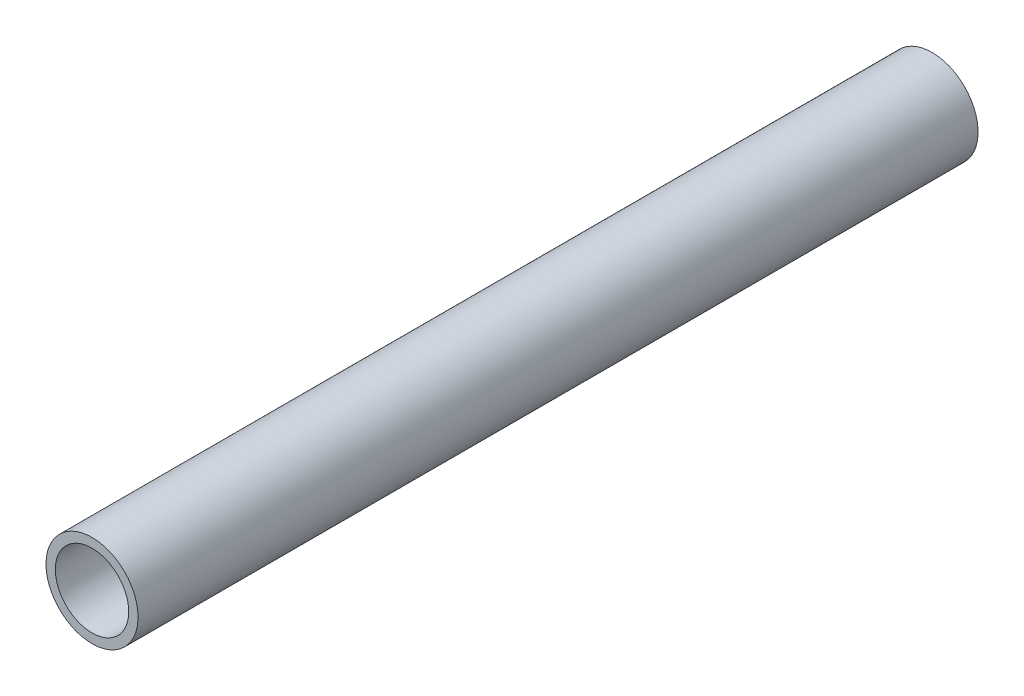
ISO-10303-21;
HEADER;
FILE_DESCRIPTION(('STEP AP214'),'2;1');
FILE_NAME('part.step','',(''),(''),'','','');
FILE_SCHEMA(('AUTOMOTIVE_DESIGN { 1 0 10303 214 1 1 1 1 }'));
ENDSEC;
DATA;
#1=APPLICATION_CONTEXT('core data for automotive mechanical design processes');
#2=APPLICATION_PROTOCOL_DEFINITION('international standard','automotive_design',2000,#1);
#3=PRODUCT_CONTEXT('',#1,'mechanical');
#4=PRODUCT('Part','Part','',(#3));
#5=PRODUCT_RELATED_PRODUCT_CATEGORY('part','',(#4));
#6=PRODUCT_DEFINITION_FORMATION('','',#4);
#7=PRODUCT_DEFINITION_CONTEXT('part definition',#1,'design');
#8=PRODUCT_DEFINITION('design','',#6,#7);
#9=PRODUCT_DEFINITION_SHAPE('','',#8);
#10=(LENGTH_UNIT() NAMED_UNIT(*) SI_UNIT(.MILLI.,.METRE.));
#11=(NAMED_UNIT(*) PLANE_ANGLE_UNIT() SI_UNIT($,.RADIAN.));
#12=(NAMED_UNIT(*) SI_UNIT($,.STERADIAN.) SOLID_ANGLE_UNIT());
#13=UNCERTAINTY_MEASURE_WITH_UNIT(LENGTH_MEASURE(1.E-05),#10,'distance_accuracy_value','');
#14=(GEOMETRIC_REPRESENTATION_CONTEXT(3) GLOBAL_UNCERTAINTY_ASSIGNED_CONTEXT((#13)) GLOBAL_UNIT_ASSIGNED_CONTEXT((#10,
#11,#12)) REPRESENTATION_CONTEXT('',''));
#15=CARTESIAN_POINT('',(0.,0.,0.));
#16=DIRECTION('',(0.,0.,1.));
#17=DIRECTION('',(1.,0.,0.));
#18=AXIS2_PLACEMENT_3D('',#15,#16,#17);
#19=CARTESIAN_POINT('',(0.,0.,152.4));
#20=DIRECTION('',(0.,0.,1.));
#21=DIRECTION('',(1.,0.,0.));
#22=AXIS2_PLACEMENT_3D('',#19,#20,#21);
#23=PLANE('',#22);
#24=CARTESIAN_POINT('',(0.,0.,152.4));
#25=DIRECTION('',(0.,0.,1.));
#26=DIRECTION('',(1.,0.,0.));
#27=AXIS2_PLACEMENT_3D('',#24,#25,#26);
#28=CIRCLE('',#27,16.7005);
#29=CARTESIAN_POINT('',(-16.7005,0.,152.4));
#30=VERTEX_POINT('',#29);
#31=EDGE_CURVE('E11',#30,#30,#28,.T.);
#32=ORIENTED_EDGE('',*,*,#31,.T.);
#33=EDGE_LOOP('',(#32));
#34=FACE_BOUND('',#33,.T.);
#35=CARTESIAN_POINT('',(0.,0.,152.4));
#36=DIRECTION('',(0.,0.,1.));
#37=DIRECTION('',(1.,0.,0.));
#38=AXIS2_PLACEMENT_3D('',#35,#36,#37);
#39=CIRCLE('',#38,13.3223);
#40=CARTESIAN_POINT('',(-13.3223,0.,152.4));
#41=VERTEX_POINT('',#40);
#42=EDGE_CURVE('E52',#41,#41,#39,.T.);
#43=ORIENTED_EDGE('',*,*,#42,.F.);
#44=EDGE_LOOP('',(#43));
#45=FACE_BOUND('',#44,.T.);
#46=ADVANCED_FACE('F41',(#34,#45),#23,.T.);
#47=CARTESIAN_POINT('',(0.,0.,-152.4));
#48=DIRECTION('',(0.,0.,1.));
#49=DIRECTION('',(1.,0.,0.));
#50=AXIS2_PLACEMENT_3D('',#47,#48,#49);
#51=PLANE('',#50);
#52=CARTESIAN_POINT('',(0.,0.,-152.4));
#53=DIRECTION('',(0.,0.,1.));
#54=DIRECTION('',(1.,0.,0.));
#55=AXIS2_PLACEMENT_3D('',#52,#53,#54);
#56=CIRCLE('',#55,16.7005);
#57=CARTESIAN_POINT('',(-16.7005,0.,-152.4));
#58=VERTEX_POINT('',#57);
#59=EDGE_CURVE('E45',#58,#58,#56,.T.);
#60=ORIENTED_EDGE('',*,*,#59,.F.);
#61=EDGE_LOOP('',(#60));
#62=FACE_BOUND('',#61,.T.);
#63=CARTESIAN_POINT('',(0.,0.,-152.4));
#64=DIRECTION('',(0.,0.,1.));
#65=DIRECTION('',(1.,0.,0.));
#66=AXIS2_PLACEMENT_3D('',#63,#64,#65);
#67=CIRCLE('',#66,13.3223);
#68=CARTESIAN_POINT('',(-13.3223,0.,-152.4));
#69=VERTEX_POINT('',#68);
#70=EDGE_CURVE('E54',#69,#69,#67,.T.);
#71=ORIENTED_EDGE('',*,*,#70,.T.);
#72=EDGE_LOOP('',(#71));
#73=FACE_BOUND('',#72,.T.);
#74=ADVANCED_FACE('F64',(#62,#73),#51,.F.);
#75=CARTESIAN_POINT('',(0.,0.,152.4));
#76=DIRECTION('',(0.,0.,-1.));
#77=DIRECTION('',(-1.,0.,0.));
#78=AXIS2_PLACEMENT_3D('',#75,#76,#77);
#79=CYLINDRICAL_SURFACE('',#78,16.7005);
#80=CARTESIAN_POINT('',(-16.7005,0.,152.4));
#81=CARTESIAN_POINT('',(-16.7005,0.,149.225));
#82=CARTESIAN_POINT('',(-16.7005,0.,146.05));
#83=CARTESIAN_POINT('',(-16.7005,0.,139.7));
#84=CARTESIAN_POINT('',(-16.7005,0.,136.525));
#85=CARTESIAN_POINT('',(-16.7005,0.,130.175));
#86=CARTESIAN_POINT('',(-16.7005,0.,127.));
#87=CARTESIAN_POINT('',(-16.7005,0.,120.65));
#88=CARTESIAN_POINT('',(-16.7005,0.,117.475));
#89=CARTESIAN_POINT('',(-16.7005,0.,111.125));
#90=CARTESIAN_POINT('',(-16.7005,0.,107.95));
#91=CARTESIAN_POINT('',(-16.7005,0.,101.6));
#92=CARTESIAN_POINT('',(-16.7005,0.,98.425));
#93=CARTESIAN_POINT('',(-16.7005,0.,92.075));
#94=CARTESIAN_POINT('',(-16.7005,0.,88.9));
#95=CARTESIAN_POINT('',(-16.7005,0.,82.55));
#96=CARTESIAN_POINT('',(-16.7005,0.,79.375));
#97=CARTESIAN_POINT('',(-16.7005,0.,73.025));
#98=CARTESIAN_POINT('',(-16.7005,0.,69.85));
#99=CARTESIAN_POINT('',(-16.7005,0.,63.5));
#100=CARTESIAN_POINT('',(-16.7005,0.,60.325));
#101=CARTESIAN_POINT('',(-16.7005,0.,53.975));
#102=CARTESIAN_POINT('',(-16.7005,0.,50.8));
#103=CARTESIAN_POINT('',(-16.7005,0.,44.45));
#104=CARTESIAN_POINT('',(-16.7005,0.,41.275));
#105=CARTESIAN_POINT('',(-16.7005,0.,34.925));
#106=CARTESIAN_POINT('',(-16.7005,0.,31.75));
#107=CARTESIAN_POINT('',(-16.7005,0.,25.4));
#108=CARTESIAN_POINT('',(-16.7005,0.,22.225));
#109=CARTESIAN_POINT('',(-16.7005,0.,15.875));
#110=CARTESIAN_POINT('',(-16.7005,0.,12.7));
#111=CARTESIAN_POINT('',(-16.7005,0.,6.35));
#112=CARTESIAN_POINT('',(-16.7005,0.,3.175));
#113=CARTESIAN_POINT('',(-16.7005,0.,-3.175));
#114=CARTESIAN_POINT('',(-16.7005,0.,-6.35));
#115=CARTESIAN_POINT('',(-16.7005,0.,-12.7));
#116=CARTESIAN_POINT('',(-16.7005,0.,-15.875));
#117=CARTESIAN_POINT('',(-16.7005,0.,-22.225));
#118=CARTESIAN_POINT('',(-16.7005,0.,-25.4));
#119=CARTESIAN_POINT('',(-16.7005,0.,-31.75));
#120=CARTESIAN_POINT('',(-16.7005,0.,-34.925));
#121=CARTESIAN_POINT('',(-16.7005,0.,-41.275));
#122=CARTESIAN_POINT('',(-16.7005,0.,-44.45));
#123=CARTESIAN_POINT('',(-16.7005,0.,-50.8));
#124=CARTESIAN_POINT('',(-16.7005,0.,-53.975));
#125=CARTESIAN_POINT('',(-16.7005,0.,-60.325));
#126=CARTESIAN_POINT('',(-16.7005,0.,-63.5));
#127=CARTESIAN_POINT('',(-16.7005,0.,-69.85));
#128=CARTESIAN_POINT('',(-16.7005,0.,-73.025));
#129=CARTESIAN_POINT('',(-16.7005,0.,-79.375));
#130=CARTESIAN_POINT('',(-16.7005,0.,-82.55));
#131=CARTESIAN_POINT('',(-16.7005,0.,-88.9));
#132=CARTESIAN_POINT('',(-16.7005,0.,-92.075));
#133=CARTESIAN_POINT('',(-16.7005,0.,-98.425));
#134=CARTESIAN_POINT('',(-16.7005,0.,-101.6));
#135=CARTESIAN_POINT('',(-16.7005,0.,-107.95));
#136=CARTESIAN_POINT('',(-16.7005,0.,-111.125));
#137=CARTESIAN_POINT('',(-16.7005,0.,-117.475));
#138=CARTESIAN_POINT('',(-16.7005,0.,-120.65));
#139=CARTESIAN_POINT('',(-16.7005,0.,-127.));
#140=CARTESIAN_POINT('',(-16.7005,0.,-130.175));
#141=CARTESIAN_POINT('',(-16.7005,0.,-136.525));
#142=CARTESIAN_POINT('',(-16.7005,0.,-139.7));
#143=CARTESIAN_POINT('',(-16.7005,0.,-146.05));
#144=CARTESIAN_POINT('',(-16.7005,0.,-149.225));
#145=CARTESIAN_POINT('',(-16.7005,0.,-152.4));
#146=B_SPLINE_CURVE_WITH_KNOTS('',3,(#80,#81,#82,#83,#84,#85,#86,#87,#88,#89,#90,#91,#92,#93,
#94,#95,#96,#97,#98,#99,#100,#101,#102,#103,#104,#105,#106,#107,#108,#109,#110,#111,#112,#113,
#114,#115,#116,#117,#118,#119,#120,#121,#122,#123,#124,#125,#126,#127,#128,#129,#130,#131,#132,
#133,#134,#135,#136,#137,#138,#139,#140,#141,#142,#143,#144,#145),.UNSPECIFIED.,.F.,.F.,(4,2,2,
2,2,2,2,2,2,2,2,2,2,2,2,2,2,2,2,2,2,2,2,2,2,2,2,2,2,2,2,2,4),(0.,9.52500000000001,19.05,28.575,
38.1,47.625,57.15,66.675,76.2,85.725,95.25,104.775,114.3,123.825,133.35,142.875,152.4,161.925,
171.45,180.975,190.5,200.025,209.55,219.075,228.6,238.125,247.65,257.175,266.7,276.225,285.75,
295.275,304.8),.UNSPECIFIED.);
#147=EDGE_CURVE('BSEAM43',#30,#58,#146,.T.);
#148=ORIENTED_EDGE('',*,*,#31,.F.);
#149=ORIENTED_EDGE('',*,*,#59,.T.);
#150=ORIENTED_EDGE('',*,*,#147,.T.);
#151=ORIENTED_EDGE('',*,*,#147,.F.);
#152=EDGE_LOOP('',(#148,#150,#149,#151));
#153=FACE_BOUND('',#152,.T.);
#154=ADVANCED_FACE('F43',(#153),#79,.T.);
#155=CARTESIAN_POINT('',(0.,0.,152.4));
#156=DIRECTION('',(0.,0.,-1.));
#157=DIRECTION('',(-1.,0.,0.));
#158=AXIS2_PLACEMENT_3D('',#155,#156,#157);
#159=CYLINDRICAL_SURFACE('',#158,13.3223);
#160=CARTESIAN_POINT('',(-13.3223,0.,152.4));
#161=CARTESIAN_POINT('',(-13.3223,0.,149.225));
#162=CARTESIAN_POINT('',(-13.3223,0.,146.05));
#163=CARTESIAN_POINT('',(-13.3223,0.,139.7));
#164=CARTESIAN_POINT('',(-13.3223,0.,136.525));
#165=CARTESIAN_POINT('',(-13.3223,0.,130.175));
#166=CARTESIAN_POINT('',(-13.3223,0.,127.));
#167=CARTESIAN_POINT('',(-13.3223,0.,120.65));
#168=CARTESIAN_POINT('',(-13.3223,0.,117.475));
#169=CARTESIAN_POINT('',(-13.3223,0.,111.125));
#170=CARTESIAN_POINT('',(-13.3223,0.,107.95));
#171=CARTESIAN_POINT('',(-13.3223,0.,101.6));
#172=CARTESIAN_POINT('',(-13.3223,0.,98.425));
#173=CARTESIAN_POINT('',(-13.3223,0.,92.075));
#174=CARTESIAN_POINT('',(-13.3223,0.,88.9));
#175=CARTESIAN_POINT('',(-13.3223,0.,82.55));
#176=CARTESIAN_POINT('',(-13.3223,0.,79.375));
#177=CARTESIAN_POINT('',(-13.3223,0.,73.025));
#178=CARTESIAN_POINT('',(-13.3223,0.,69.85));
#179=CARTESIAN_POINT('',(-13.3223,0.,63.5));
#180=CARTESIAN_POINT('',(-13.3223,0.,60.325));
#181=CARTESIAN_POINT('',(-13.3223,0.,53.975));
#182=CARTESIAN_POINT('',(-13.3223,0.,50.8));
#183=CARTESIAN_POINT('',(-13.3223,0.,44.45));
#184=CARTESIAN_POINT('',(-13.3223,0.,41.275));
#185=CARTESIAN_POINT('',(-13.3223,0.,34.925));
#186=CARTESIAN_POINT('',(-13.3223,0.,31.75));
#187=CARTESIAN_POINT('',(-13.3223,0.,25.4));
#188=CARTESIAN_POINT('',(-13.3223,0.,22.225));
#189=CARTESIAN_POINT('',(-13.3223,0.,15.875));
#190=CARTESIAN_POINT('',(-13.3223,0.,12.7));
#191=CARTESIAN_POINT('',(-13.3223,0.,6.35));
#192=CARTESIAN_POINT('',(-13.3223,0.,3.175));
#193=CARTESIAN_POINT('',(-13.3223,0.,-3.175));
#194=CARTESIAN_POINT('',(-13.3223,0.,-6.35));
#195=CARTESIAN_POINT('',(-13.3223,0.,-12.7));
#196=CARTESIAN_POINT('',(-13.3223,0.,-15.875));
#197=CARTESIAN_POINT('',(-13.3223,0.,-22.225));
#198=CARTESIAN_POINT('',(-13.3223,0.,-25.4));
#199=CARTESIAN_POINT('',(-13.3223,0.,-31.75));
#200=CARTESIAN_POINT('',(-13.3223,0.,-34.925));
#201=CARTESIAN_POINT('',(-13.3223,0.,-41.275));
#202=CARTESIAN_POINT('',(-13.3223,0.,-44.45));
#203=CARTESIAN_POINT('',(-13.3223,0.,-50.8));
#204=CARTESIAN_POINT('',(-13.3223,0.,-53.975));
#205=CARTESIAN_POINT('',(-13.3223,0.,-60.325));
#206=CARTESIAN_POINT('',(-13.3223,0.,-63.5));
#207=CARTESIAN_POINT('',(-13.3223,0.,-69.85));
#208=CARTESIAN_POINT('',(-13.3223,0.,-73.025));
#209=CARTESIAN_POINT('',(-13.3223,0.,-79.375));
#210=CARTESIAN_POINT('',(-13.3223,0.,-82.55));
#211=CARTESIAN_POINT('',(-13.3223,0.,-88.9));
#212=CARTESIAN_POINT('',(-13.3223,0.,-92.075));
#213=CARTESIAN_POINT('',(-13.3223,0.,-98.425));
#214=CARTESIAN_POINT('',(-13.3223,0.,-101.6));
#215=CARTESIAN_POINT('',(-13.3223,0.,-107.95));
#216=CARTESIAN_POINT('',(-13.3223,0.,-111.125));
#217=CARTESIAN_POINT('',(-13.3223,0.,-117.475));
#218=CARTESIAN_POINT('',(-13.3223,0.,-120.65));
#219=CARTESIAN_POINT('',(-13.3223,0.,-127.));
#220=CARTESIAN_POINT('',(-13.3223,0.,-130.175));
#221=CARTESIAN_POINT('',(-13.3223,0.,-136.525));
#222=CARTESIAN_POINT('',(-13.3223,0.,-139.7));
#223=CARTESIAN_POINT('',(-13.3223,0.,-146.05));
#224=CARTESIAN_POINT('',(-13.3223,0.,-149.225));
#225=CARTESIAN_POINT('',(-13.3223,0.,-152.4));
#226=B_SPLINE_CURVE_WITH_KNOTS('',3,(#160,#161,#162,#163,#164,#165,#166,#167,#168,#169,#170,
#171,#172,#173,#174,#175,#176,#177,#178,#179,#180,#181,#182,#183,#184,#185,#186,#187,#188,#189,
#190,#191,#192,#193,#194,#195,#196,#197,#198,#199,#200,#201,#202,#203,#204,#205,#206,#207,#208,
#209,#210,#211,#212,#213,#214,#215,#216,#217,#218,#219,#220,#221,#222,#223,#224,#225),
.UNSPECIFIED.,.F.,.F.,(4,2,2,2,2,2,2,2,2,2,2,2,2,2,2,2,2,2,2,2,2,2,2,2,2,2,2,2,2,2,2,2,4),(0.,
9.52500000000001,19.05,28.575,38.1,47.625,57.15,66.675,76.2,85.725,95.25,104.775,114.3,123.825,
133.35,142.875,152.4,161.925,171.45,180.975,190.5,200.025,209.55,219.075,228.6,238.125,247.65,
257.175,266.7,276.225,285.75,295.275,304.8),.UNSPECIFIED.);
#227=EDGE_CURVE('BSEAM60',#41,#69,#226,.T.);
#228=ORIENTED_EDGE('',*,*,#42,.T.);
#229=ORIENTED_EDGE('',*,*,#70,.F.);
#230=ORIENTED_EDGE('',*,*,#227,.T.);
#231=ORIENTED_EDGE('',*,*,#227,.F.);
#232=EDGE_LOOP('',(#228,#230,#229,#231));
#233=FACE_BOUND('',#232,.T.);
#234=ADVANCED_FACE('F60',(#233),#159,.F.);
#235=CLOSED_SHELL('',(#46,#74,#154,#234));
#236=MANIFOLD_SOLID_BREP('B2',#235);
#237=ADVANCED_BREP_SHAPE_REPRESENTATION('',(#18,#236),#14);
#238=SHAPE_DEFINITION_REPRESENTATION(#9,#237);
ENDSEC;
END-ISO-10303-21;
